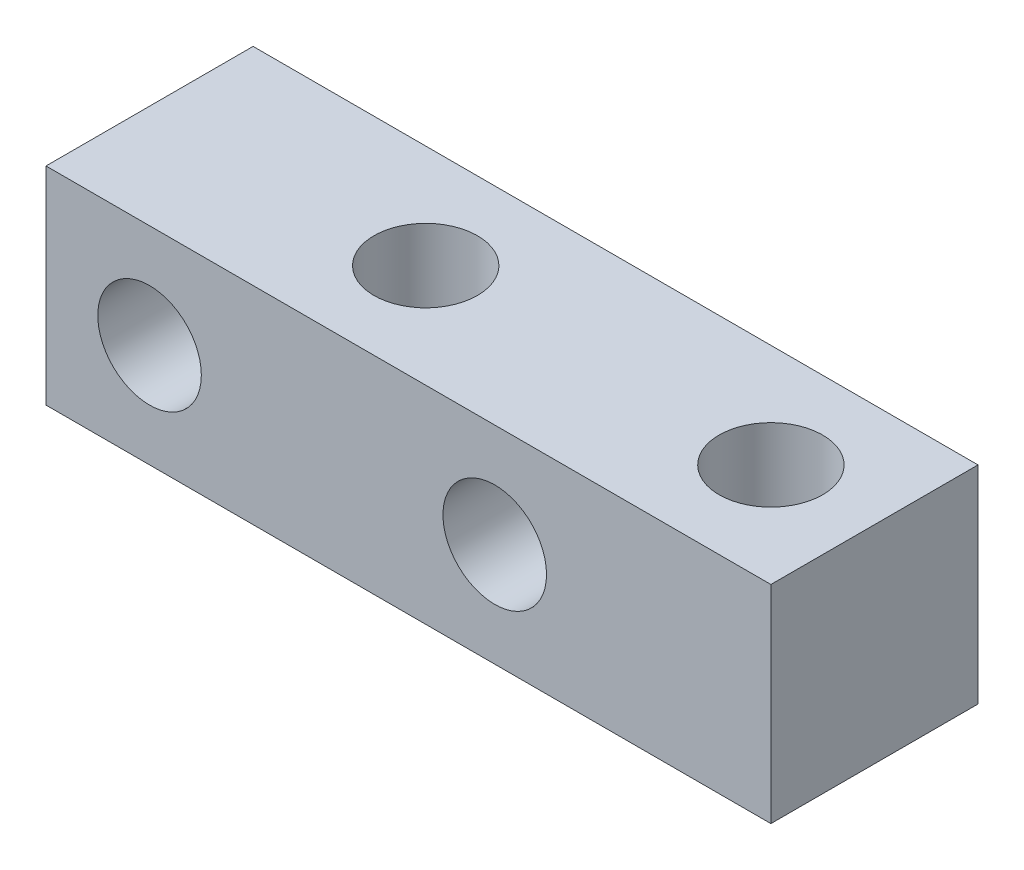
ISO-10303-21;
HEADER;
FILE_DESCRIPTION(('STEP AP214'),'2;1');
FILE_NAME('part.step','',(''),(''),'','','');
FILE_SCHEMA(('AUTOMOTIVE_DESIGN { 1 0 10303 214 1 1 1 1 }'));
ENDSEC;
DATA;
#1=APPLICATION_CONTEXT('core data for automotive mechanical design processes');
#2=APPLICATION_PROTOCOL_DEFINITION('international standard','automotive_design',2000,#1);
#3=PRODUCT_CONTEXT('',#1,'mechanical');
#4=PRODUCT('Part','Part','',(#3));
#5=PRODUCT_RELATED_PRODUCT_CATEGORY('part','',(#4));
#6=PRODUCT_DEFINITION_FORMATION('','',#4);
#7=PRODUCT_DEFINITION_CONTEXT('part definition',#1,'design');
#8=PRODUCT_DEFINITION('design','',#6,#7);
#9=PRODUCT_DEFINITION_SHAPE('','',#8);
#10=(LENGTH_UNIT() NAMED_UNIT(*) SI_UNIT(.MILLI.,.METRE.));
#11=(NAMED_UNIT(*) PLANE_ANGLE_UNIT() SI_UNIT($,.RADIAN.));
#12=(NAMED_UNIT(*) SI_UNIT($,.STERADIAN.) SOLID_ANGLE_UNIT());
#13=UNCERTAINTY_MEASURE_WITH_UNIT(LENGTH_MEASURE(1.E-05),#10,'distance_accuracy_value','');
#14=(GEOMETRIC_REPRESENTATION_CONTEXT(3) GLOBAL_UNCERTAINTY_ASSIGNED_CONTEXT((#13)) GLOBAL_UNIT_ASSIGNED_CONTEXT((#10,
#11,#12)) REPRESENTATION_CONTEXT('',''));
#15=CARTESIAN_POINT('',(0.,0.,0.));
#16=DIRECTION('',(0.,0.,1.));
#17=DIRECTION('',(1.,0.,0.));
#18=AXIS2_PLACEMENT_3D('',#15,#16,#17);
#19=CARTESIAN_POINT('',(0.,0.,6.));
#20=DIRECTION('',(0.,0.,-1.));
#21=DIRECTION('',(-1.,0.,0.));
#22=AXIS2_PLACEMENT_3D('',#19,#20,#21);
#23=PLANE('',#22);
#24=DIRECTION('',(0.,-1.,0.));
#25=VECTOR('',#24,1.);
#26=CARTESIAN_POINT('',(-12.4935848355133,1.99161799371954,6.));
#27=LINE('',#26,#25);
#28=CARTESIAN_POINT('',(-12.4935848355133,7.99161799371954,6.));
#29=VERTEX_POINT('',#28);
#30=CARTESIAN_POINT('',(-12.4935848355133,1.99161799371954,6.));
#31=VERTEX_POINT('',#30);
#32=EDGE_CURVE('E94',#29,#31,#27,.T.);
#33=ORIENTED_EDGE('',*,*,#32,.T.);
#34=DIRECTION('',(1.,0.,0.));
#35=VECTOR('',#34,1.);
#36=CARTESIAN_POINT('',(8.50641516448671,1.99161799371954,6.));
#37=LINE('',#36,#35);
#38=CARTESIAN_POINT('',(8.50641516448671,1.99161799371954,6.));
#39=VERTEX_POINT('',#38);
#40=EDGE_CURVE('E89',#31,#39,#37,.T.);
#41=ORIENTED_EDGE('',*,*,#40,.T.);
#42=DIRECTION('',(0.,1.,0.));
#43=VECTOR('',#42,1.);
#44=CARTESIAN_POINT('',(8.50641516448671,7.99161799371954,6.));
#45=LINE('',#44,#43);
#46=CARTESIAN_POINT('',(8.50641516448671,7.99161799371954,6.));
#47=VERTEX_POINT('',#46);
#48=EDGE_CURVE('E92',#39,#47,#45,.T.);
#49=ORIENTED_EDGE('',*,*,#48,.T.);
#50=DIRECTION('',(-1.,0.,0.));
#51=VECTOR('',#50,1.);
#52=CARTESIAN_POINT('',(-12.4935848355133,7.99161799371954,6.));
#53=LINE('',#52,#51);
#54=EDGE_CURVE('E59',#47,#29,#53,.T.);
#55=ORIENTED_EDGE('',*,*,#54,.T.);
#56=EDGE_LOOP('',(#33,#41,#49,#55));
#57=FACE_BOUND('',#56,.T.);
#58=CARTESIAN_POINT('',(-9.49358483551329,4.99161799371954,6.));
#59=DIRECTION('',(0.,0.,1.));
#60=DIRECTION('',(1.,0.,0.));
#61=AXIS2_PLACEMENT_3D('',#58,#59,#60);
#62=CIRCLE('',#61,1.5);
#63=CARTESIAN_POINT('',(-7.99358483551329,4.99161799371954,6.));
#64=VERTEX_POINT('',#63);
#65=EDGE_CURVE('E109',#64,#64,#62,.T.);
#66=ORIENTED_EDGE('',*,*,#65,.F.);
#67=EDGE_LOOP('',(#66));
#68=FACE_BOUND('',#67,.T.);
#69=CARTESIAN_POINT('',(0.50641516448671,4.99161799371954,6.));
#70=DIRECTION('',(0.,0.,1.));
#71=DIRECTION('',(1.,0.,0.));
#72=AXIS2_PLACEMENT_3D('',#69,#70,#71);
#73=CIRCLE('',#72,1.5);
#74=CARTESIAN_POINT('',(2.00641516448671,4.99161799371954,6.));
#75=VERTEX_POINT('',#74);
#76=EDGE_CURVE('E124',#75,#75,#73,.T.);
#77=ORIENTED_EDGE('',*,*,#76,.F.);
#78=EDGE_LOOP('',(#77));
#79=FACE_BOUND('',#78,.T.);
#80=ADVANCED_FACE('F42',(#57,#68,#79),#23,.F.);
#81=CARTESIAN_POINT('',(0.,0.,0.));
#82=DIRECTION('',(0.,0.,-1.));
#83=DIRECTION('',(-1.,0.,0.));
#84=AXIS2_PLACEMENT_3D('',#81,#82,#83);
#85=PLANE('',#84);
#86=CARTESIAN_POINT('',(-9.49358483551329,4.99161799371954,0.));
#87=DIRECTION('',(0.,0.,1.));
#88=DIRECTION('',(1.,0.,0.));
#89=AXIS2_PLACEMENT_3D('',#86,#87,#88);
#90=CIRCLE('',#89,1.5);
#91=CARTESIAN_POINT('',(-7.99358483551329,4.99161799371954,0.));
#92=VERTEX_POINT('',#91);
#93=EDGE_CURVE('E121',#92,#92,#90,.T.);
#94=ORIENTED_EDGE('',*,*,#93,.T.);
#95=EDGE_LOOP('',(#94));
#96=FACE_BOUND('',#95,.T.);
#97=DIRECTION('',(0.,-1.,0.));
#98=VECTOR('',#97,1.);
#99=CARTESIAN_POINT('',(-12.4935848355133,1.99161799371954,0.));
#100=LINE('',#99,#98);
#101=CARTESIAN_POINT('',(-12.4935848355133,7.99161799371954,0.));
#102=VERTEX_POINT('',#101);
#103=CARTESIAN_POINT('',(-12.4935848355133,1.99161799371954,0.));
#104=VERTEX_POINT('',#103);
#105=EDGE_CURVE('E106',#102,#104,#100,.T.);
#106=ORIENTED_EDGE('',*,*,#105,.F.);
#107=DIRECTION('',(-1.,0.,0.));
#108=VECTOR('',#107,1.);
#109=CARTESIAN_POINT('',(-12.4935848355133,7.99161799371954,0.));
#110=LINE('',#109,#108);
#111=CARTESIAN_POINT('',(8.50641516448671,7.99161799371954,0.));
#112=VERTEX_POINT('',#111);
#113=EDGE_CURVE('E82',#112,#102,#110,.T.);
#114=ORIENTED_EDGE('',*,*,#113,.F.);
#115=DIRECTION('',(0.,1.,0.));
#116=VECTOR('',#115,1.);
#117=CARTESIAN_POINT('',(8.50641516448671,7.99161799371954,0.));
#118=LINE('',#117,#116);
#119=CARTESIAN_POINT('',(8.50641516448671,1.99161799371954,0.));
#120=VERTEX_POINT('',#119);
#121=EDGE_CURVE('E76',#120,#112,#118,.T.);
#122=ORIENTED_EDGE('',*,*,#121,.F.);
#123=DIRECTION('',(1.,0.,0.));
#124=VECTOR('',#123,1.);
#125=CARTESIAN_POINT('',(8.50641516448671,1.99161799371954,0.));
#126=LINE('',#125,#124);
#127=EDGE_CURVE('E98',#104,#120,#126,.T.);
#128=ORIENTED_EDGE('',*,*,#127,.F.);
#129=EDGE_LOOP('',(#106,#114,#122,#128));
#130=FACE_BOUND('',#129,.T.);
#131=CARTESIAN_POINT('',(0.50641516448671,4.99161799371954,0.));
#132=DIRECTION('',(0.,0.,1.));
#133=DIRECTION('',(1.,0.,0.));
#134=AXIS2_PLACEMENT_3D('',#131,#132,#133);
#135=CIRCLE('',#134,1.5);
#136=CARTESIAN_POINT('',(2.00641516448671,4.99161799371954,0.));
#137=VERTEX_POINT('',#136);
#138=EDGE_CURVE('E127',#137,#137,#135,.T.);
#139=ORIENTED_EDGE('',*,*,#138,.T.);
#140=EDGE_LOOP('',(#139));
#141=FACE_BOUND('',#140,.T.);
#142=ADVANCED_FACE('F117',(#96,#130,#141),#85,.T.);
#143=CARTESIAN_POINT('',(-12.4935848355133,1.99161799371954,6.));
#144=DIRECTION('',(1.,0.,0.));
#145=DIRECTION('',(0.,0.,-1.));
#146=AXIS2_PLACEMENT_3D('',#143,#144,#145);
#147=PLANE('',#146);
#148=ORIENTED_EDGE('',*,*,#105,.T.);
#149=DIRECTION('',(0.,0.,-1.));
#150=VECTOR('',#149,1.);
#151=CARTESIAN_POINT('',(-12.4935848355133,1.99161799371954,6.));
#152=LINE('',#151,#150);
#153=EDGE_CURVE('E11',#31,#104,#152,.T.);
#154=ORIENTED_EDGE('',*,*,#153,.F.);
#155=ORIENTED_EDGE('',*,*,#32,.F.);
#156=DIRECTION('',(0.,0.,-1.));
#157=VECTOR('',#156,1.);
#158=CARTESIAN_POINT('',(-12.4935848355133,7.99161799371954,6.));
#159=LINE('',#158,#157);
#160=EDGE_CURVE('E102',#29,#102,#159,.T.);
#161=ORIENTED_EDGE('',*,*,#160,.T.);
#162=EDGE_LOOP('',(#148,#154,#155,#161));
#163=FACE_BOUND('',#162,.T.);
#164=ADVANCED_FACE('F44',(#163),#147,.F.);
#165=CARTESIAN_POINT('',(8.50641516448671,1.99161799371954,6.));
#166=DIRECTION('',(0.,1.,0.));
#167=DIRECTION('',(-1.,0.,0.));
#168=AXIS2_PLACEMENT_3D('',#165,#166,#167);
#169=PLANE('',#168);
#170=CARTESIAN_POINT('',(5.50641516448671,1.99161799371954,3.));
#171=DIRECTION('',(0.,-1.,0.));
#172=DIRECTION('',(1.,0.,0.));
#173=AXIS2_PLACEMENT_3D('',#170,#171,#172);
#174=CIRCLE('',#173,1.5);
#175=CARTESIAN_POINT('',(7.00641516448671,1.99161799371954,3.));
#176=VERTEX_POINT('',#175);
#177=EDGE_CURVE('E139',#176,#176,#174,.T.);
#178=ORIENTED_EDGE('',*,*,#177,.F.);
#179=EDGE_LOOP('',(#178));
#180=FACE_BOUND('',#179,.T.);
#181=CARTESIAN_POINT('',(-4.49358483551329,1.99161799371954,3.));
#182=DIRECTION('',(0.,-1.,0.));
#183=DIRECTION('',(1.,0.,0.));
#184=AXIS2_PLACEMENT_3D('',#181,#182,#183);
#185=CIRCLE('',#184,1.5);
#186=CARTESIAN_POINT('',(-2.99358483551329,1.99161799371954,3.));
#187=VERTEX_POINT('',#186);
#188=EDGE_CURVE('E136',#187,#187,#185,.T.);
#189=ORIENTED_EDGE('',*,*,#188,.F.);
#190=EDGE_LOOP('',(#189));
#191=FACE_BOUND('',#190,.T.);
#192=ORIENTED_EDGE('',*,*,#127,.T.);
#193=DIRECTION('',(0.,0.,-1.));
#194=VECTOR('',#193,1.);
#195=CARTESIAN_POINT('',(8.50641516448671,1.99161799371954,6.));
#196=LINE('',#195,#194);
#197=EDGE_CURVE('E51',#39,#120,#196,.T.);
#198=ORIENTED_EDGE('',*,*,#197,.F.);
#199=ORIENTED_EDGE('',*,*,#40,.F.);
#200=ORIENTED_EDGE('',*,*,#153,.T.);
#201=EDGE_LOOP('',(#192,#198,#199,#200));
#202=FACE_BOUND('',#201,.T.);
#203=ADVANCED_FACE('F97',(#180,#191,#202),#169,.F.);
#204=CARTESIAN_POINT('',(8.50641516448671,7.99161799371954,6.));
#205=DIRECTION('',(-1.,0.,0.));
#206=DIRECTION('',(0.,0.,1.));
#207=AXIS2_PLACEMENT_3D('',#204,#205,#206);
#208=PLANE('',#207);
#209=ORIENTED_EDGE('',*,*,#121,.T.);
#210=DIRECTION('',(0.,0.,-1.));
#211=VECTOR('',#210,1.);
#212=CARTESIAN_POINT('',(8.50641516448671,7.99161799371954,6.));
#213=LINE('',#212,#211);
#214=EDGE_CURVE('E99',#47,#112,#213,.T.);
#215=ORIENTED_EDGE('',*,*,#214,.F.);
#216=ORIENTED_EDGE('',*,*,#48,.F.);
#217=ORIENTED_EDGE('',*,*,#197,.T.);
#218=EDGE_LOOP('',(#209,#215,#216,#217));
#219=FACE_BOUND('',#218,.T.);
#220=ADVANCED_FACE('F100',(#219),#208,.F.);
#221=CARTESIAN_POINT('',(-12.4935848355133,7.99161799371954,6.));
#222=DIRECTION('',(0.,-1.,0.));
#223=DIRECTION('',(0.,0.,-1.));
#224=AXIS2_PLACEMENT_3D('',#221,#222,#223);
#225=PLANE('',#224);
#226=CARTESIAN_POINT('',(5.50641516448671,7.99161799371954,3.));
#227=DIRECTION('',(0.,-1.,0.));
#228=DIRECTION('',(1.,0.,0.));
#229=AXIS2_PLACEMENT_3D('',#226,#227,#228);
#230=CIRCLE('',#229,1.5);
#231=CARTESIAN_POINT('',(7.00641516448671,7.99161799371954,3.));
#232=VERTEX_POINT('',#231);
#233=EDGE_CURVE('E130',#232,#232,#230,.T.);
#234=ORIENTED_EDGE('',*,*,#233,.T.);
#235=EDGE_LOOP('',(#234));
#236=FACE_BOUND('',#235,.T.);
#237=CARTESIAN_POINT('',(-4.49358483551329,7.99161799371954,3.));
#238=DIRECTION('',(0.,-1.,0.));
#239=DIRECTION('',(1.,0.,0.));
#240=AXIS2_PLACEMENT_3D('',#237,#238,#239);
#241=CIRCLE('',#240,1.5);
#242=CARTESIAN_POINT('',(-2.99358483551329,7.99161799371954,3.));
#243=VERTEX_POINT('',#242);
#244=EDGE_CURVE('E133',#243,#243,#241,.T.);
#245=ORIENTED_EDGE('',*,*,#244,.T.);
#246=EDGE_LOOP('',(#245));
#247=FACE_BOUND('',#246,.T.);
#248=ORIENTED_EDGE('',*,*,#113,.T.);
#249=ORIENTED_EDGE('',*,*,#160,.F.);
#250=ORIENTED_EDGE('',*,*,#54,.F.);
#251=ORIENTED_EDGE('',*,*,#214,.T.);
#252=EDGE_LOOP('',(#248,#249,#250,#251));
#253=FACE_BOUND('',#252,.T.);
#254=ADVANCED_FACE('F114',(#236,#247,#253),#225,.F.);
#255=CARTESIAN_POINT('',(-9.49358483551329,4.99161799371954,6.));
#256=DIRECTION('',(0.,0.,-1.));
#257=DIRECTION('',(-1.,0.,0.));
#258=AXIS2_PLACEMENT_3D('',#255,#256,#257);
#259=CYLINDRICAL_SURFACE('',#258,1.5);
#260=ORIENTED_EDGE('',*,*,#65,.T.);
#261=EDGE_LOOP('',(#260));
#262=FACE_BOUND('',#261,.T.);
#263=ORIENTED_EDGE('',*,*,#93,.F.);
#264=EDGE_LOOP('',(#263));
#265=FACE_BOUND('',#264,.T.);
#266=ADVANCED_FACE('F166',(#262,#265),#259,.F.);
#267=CARTESIAN_POINT('',(0.50641516448671,4.99161799371954,6.));
#268=DIRECTION('',(0.,0.,-1.));
#269=DIRECTION('',(-1.,0.,0.));
#270=AXIS2_PLACEMENT_3D('',#267,#268,#269);
#271=CYLINDRICAL_SURFACE('',#270,1.5);
#272=ORIENTED_EDGE('',*,*,#76,.T.);
#273=EDGE_LOOP('',(#272));
#274=FACE_BOUND('',#273,.T.);
#275=ORIENTED_EDGE('',*,*,#138,.F.);
#276=EDGE_LOOP('',(#275));
#277=FACE_BOUND('',#276,.T.);
#278=ADVANCED_FACE('F159',(#274,#277),#271,.F.);
#279=CARTESIAN_POINT('',(-4.49358483551329,7.99161799371954,3.));
#280=DIRECTION('',(0.,-1.,0.));
#281=DIRECTION('',(1.,0.,0.));
#282=AXIS2_PLACEMENT_3D('',#279,#280,#281);
#283=CYLINDRICAL_SURFACE('',#282,1.5);
#284=ORIENTED_EDGE('',*,*,#244,.F.);
#285=EDGE_LOOP('',(#284));
#286=FACE_BOUND('',#285,.T.);
#287=ORIENTED_EDGE('',*,*,#188,.T.);
#288=EDGE_LOOP('',(#287));
#289=FACE_BOUND('',#288,.T.);
#290=ADVANCED_FACE('F150',(#286,#289),#283,.F.);
#291=CARTESIAN_POINT('',(5.50641516448671,7.99161799371954,3.));
#292=DIRECTION('',(0.,-1.,0.));
#293=DIRECTION('',(1.,0.,0.));
#294=AXIS2_PLACEMENT_3D('',#291,#292,#293);
#295=CYLINDRICAL_SURFACE('',#294,1.5);
#296=ORIENTED_EDGE('',*,*,#233,.F.);
#297=EDGE_LOOP('',(#296));
#298=FACE_BOUND('',#297,.T.);
#299=ORIENTED_EDGE('',*,*,#177,.T.);
#300=EDGE_LOOP('',(#299));
#301=FACE_BOUND('',#300,.T.);
#302=ADVANCED_FACE('F147',(#298,#301),#295,.F.);
#303=CLOSED_SHELL('',(#80,#142,#164,#203,#220,#254,#266,#278,#290,#302));
#304=MANIFOLD_SOLID_BREP('B2',#303);
#305=ADVANCED_BREP_SHAPE_REPRESENTATION('',(#18,#304),#14);
#306=SHAPE_DEFINITION_REPRESENTATION(#9,#305);
ENDSEC;
END-ISO-10303-21;
